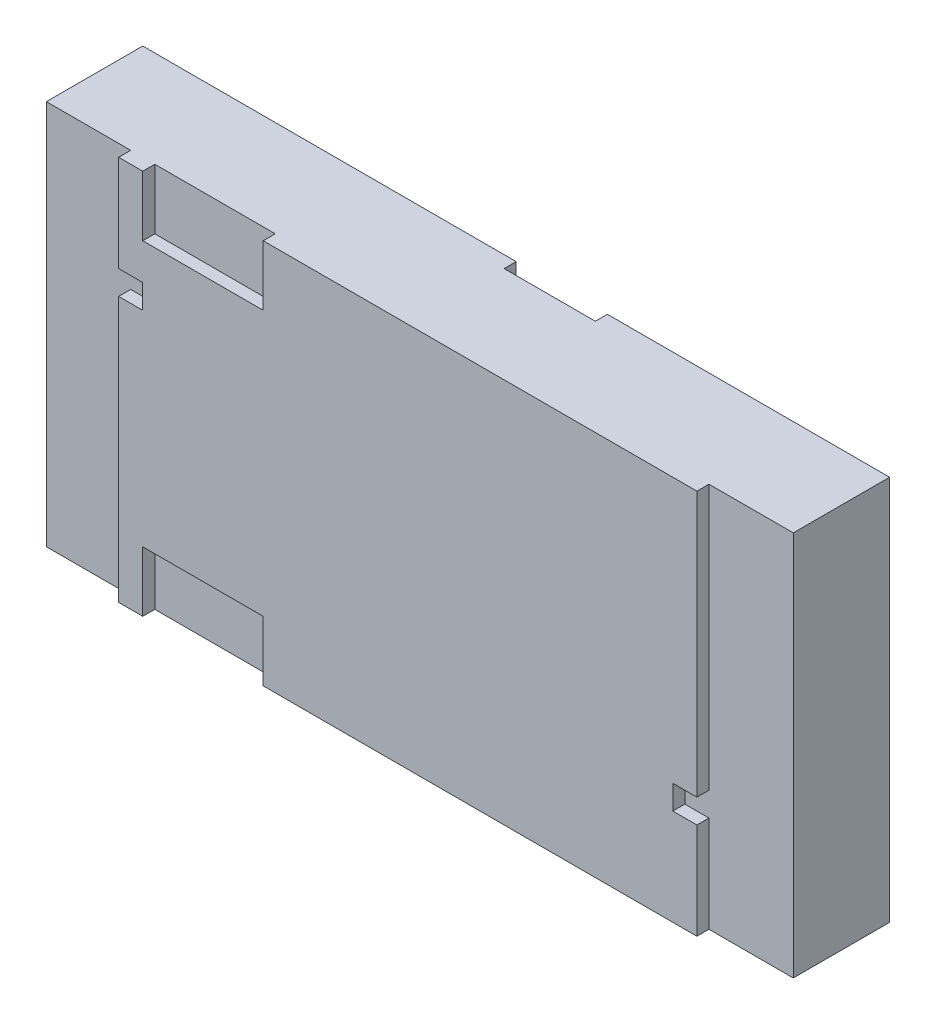
ISO-10303-21;
HEADER;
FILE_DESCRIPTION(('STEP AP214'),'2;1');
FILE_NAME('part.step','',(''),(''),'','','');
FILE_SCHEMA(('AUTOMOTIVE_DESIGN { 1 0 10303 214 1 1 1 1 }'));
ENDSEC;
DATA;
#1=APPLICATION_CONTEXT('core data for automotive mechanical design processes');
#2=APPLICATION_PROTOCOL_DEFINITION('international standard','automotive_design',2000,#1);
#3=PRODUCT_CONTEXT('',#1,'mechanical');
#4=PRODUCT('Part','Part','',(#3));
#5=PRODUCT_RELATED_PRODUCT_CATEGORY('part','',(#4));
#6=PRODUCT_DEFINITION_FORMATION('','',#4);
#7=PRODUCT_DEFINITION_CONTEXT('part definition',#1,'design');
#8=PRODUCT_DEFINITION('design','',#6,#7);
#9=PRODUCT_DEFINITION_SHAPE('','',#8);
#10=(LENGTH_UNIT() NAMED_UNIT(*) SI_UNIT(.MILLI.,.METRE.));
#11=(NAMED_UNIT(*) PLANE_ANGLE_UNIT() SI_UNIT($,.RADIAN.));
#12=(NAMED_UNIT(*) SI_UNIT($,.STERADIAN.) SOLID_ANGLE_UNIT());
#13=UNCERTAINTY_MEASURE_WITH_UNIT(LENGTH_MEASURE(1.E-05),#10,'distance_accuracy_value','');
#14=(GEOMETRIC_REPRESENTATION_CONTEXT(3) GLOBAL_UNCERTAINTY_ASSIGNED_CONTEXT((#13)) GLOBAL_UNIT_ASSIGNED_CONTEXT((#10,
#11,#12)) REPRESENTATION_CONTEXT('',''));
#15=CARTESIAN_POINT('',(0.,0.,0.));
#16=DIRECTION('',(0.,0.,1.));
#17=DIRECTION('',(1.,0.,0.));
#18=AXIS2_PLACEMENT_3D('',#15,#16,#17);
#19=CARTESIAN_POINT('',(1.6,0.8,0.));
#20=DIRECTION('',(0.,1.,0.));
#21=DIRECTION('',(1.,0.,0.));
#22=AXIS2_PLACEMENT_3D('',#19,#20,#21);
#23=PLANE('',#22);
#24=DIRECTION('',(0.,0.,-1.));
#25=VECTOR('',#24,1.);
#26=CARTESIAN_POINT('',(0.,0.80000000001,0.02500000001));
#27=LINE('',#26,#25);
#28=CARTESIAN_POINT('',(0.,0.8,0.1));
#29=VERTEX_POINT('',#28);
#30=CARTESIAN_POINT('',(0.,0.8,0.05));
#31=VERTEX_POINT('',#30);
#32=EDGE_CURVE('E345',#29,#31,#27,.T.);
#33=ORIENTED_EDGE('',*,*,#32,.T.);
#34=DIRECTION('',(1.,0.,0.));
#35=VECTOR('',#34,1.);
#36=CARTESIAN_POINT('',(0.02500000001,0.80000000001,0.05000000001));
#37=LINE('',#36,#35);
#38=CARTESIAN_POINT('',(-1.55,0.8,0.05));
#39=VERTEX_POINT('',#38);
#40=EDGE_CURVE('E538',#39,#31,#37,.T.);
#41=ORIENTED_EDGE('',*,*,#40,.F.);
#42=DIRECTION('',(0.,0.,-1.));
#43=VECTOR('',#42,1.);
#44=CARTESIAN_POINT('',(-1.55000000001,0.80000000001,0.22500000001));
#45=LINE('',#44,#43);
#46=CARTESIAN_POINT('',(-1.55,0.8,0.45));
#47=VERTEX_POINT('',#46);
#48=EDGE_CURVE('E407',#47,#39,#45,.T.);
#49=ORIENTED_EDGE('',*,*,#48,.F.);
#50=DIRECTION('',(1.,0.,0.));
#51=VECTOR('',#50,1.);
#52=CARTESIAN_POINT('',(0.37500000001,0.80000000001,0.45000000001));
#53=LINE('',#52,#51);
#54=CARTESIAN_POINT('',(-1.2,0.8,0.45));
#55=VERTEX_POINT('',#54);
#56=EDGE_CURVE('E371',#47,#55,#53,.T.);
#57=ORIENTED_EDGE('',*,*,#56,.T.);
#58=DIRECTION('',(0.,0.,1.));
#59=VECTOR('',#58,1.);
#60=CARTESIAN_POINT('',(-1.20000000001,0.80000000001,0.45000000001));
#61=LINE('',#60,#59);
#62=CARTESIAN_POINT('',(-1.2,0.8,0.5));
#63=VERTEX_POINT('',#62);
#64=EDGE_CURVE('E11',#55,#63,#61,.T.);
#65=ORIENTED_EDGE('',*,*,#64,.T.);
#66=DIRECTION('',(1.,0.,0.));
#67=VECTOR('',#66,1.);
#68=CARTESIAN_POINT('',(-0.55000000001,0.80000000001,0.50000000001));
#69=LINE('',#68,#67);
#70=CARTESIAN_POINT('',(-1.1,0.8,0.5));
#71=VERTEX_POINT('',#70);
#72=EDGE_CURVE('E610',#63,#71,#69,.T.);
#73=ORIENTED_EDGE('',*,*,#72,.T.);
#74=DIRECTION('',(0.,0.,1.));
#75=VECTOR('',#74,1.);
#76=CARTESIAN_POINT('',(-1.10000000001,0.80000000001,0.45000000001));
#77=LINE('',#76,#75);
#78=CARTESIAN_POINT('',(-1.1,0.8,0.45));
#79=VERTEX_POINT('',#78);
#80=EDGE_CURVE('E627',#79,#71,#77,.T.);
#81=ORIENTED_EDGE('',*,*,#80,.F.);
#82=DIRECTION('',(1.,0.,0.));
#83=VECTOR('',#82,1.);
#84=CARTESIAN_POINT('',(0.37500000001,0.80000000001,0.45000000001));
#85=LINE('',#84,#83);
#86=CARTESIAN_POINT('',(-0.6,0.8,0.45));
#87=VERTEX_POINT('',#86);
#88=EDGE_CURVE('E416',#79,#87,#85,.T.);
#89=ORIENTED_EDGE('',*,*,#88,.T.);
#90=DIRECTION('',(0.,0.,1.));
#91=VECTOR('',#90,1.);
#92=CARTESIAN_POINT('',(-0.60000000001,0.80000000001,0.25000000001));
#93=LINE('',#92,#91);
#94=CARTESIAN_POINT('',(-0.6,0.8,0.5));
#95=VERTEX_POINT('',#94);
#96=EDGE_CURVE('E340',#87,#95,#93,.T.);
#97=ORIENTED_EDGE('',*,*,#96,.T.);
#98=DIRECTION('',(-1.,0.,0.));
#99=VECTOR('',#98,1.);
#100=CARTESIAN_POINT('',(1.60000000001,0.80000000001,0.50000000001));
#101=LINE('',#100,#99);
#102=CARTESIAN_POINT('',(1.2,0.8,0.5));
#103=VERTEX_POINT('',#102);
#104=EDGE_CURVE('E354',#103,#95,#101,.T.);
#105=ORIENTED_EDGE('',*,*,#104,.F.);
#106=DIRECTION('',(0.,0.,1.));
#107=VECTOR('',#106,1.);
#108=CARTESIAN_POINT('',(1.20000000001,0.80000000001,0.45000000001));
#109=LINE('',#108,#107);
#110=CARTESIAN_POINT('',(1.2,0.8,0.45));
#111=VERTEX_POINT('',#110);
#112=EDGE_CURVE('E307',#111,#103,#109,.T.);
#113=ORIENTED_EDGE('',*,*,#112,.F.);
#114=DIRECTION('',(-1.,0.,0.));
#115=VECTOR('',#114,1.);
#116=CARTESIAN_POINT('',(1.57500000001,0.80000000001,0.45000000001));
#117=LINE('',#116,#115);
#118=CARTESIAN_POINT('',(1.55,0.8,0.45));
#119=VERTEX_POINT('',#118);
#120=EDGE_CURVE('E26',#119,#111,#117,.T.);
#121=ORIENTED_EDGE('',*,*,#120,.F.);
#122=DIRECTION('',(0.,0.,1.));
#123=VECTOR('',#122,1.);
#124=CARTESIAN_POINT('',(1.55000000001,0.80000000001,0.02500000001));
#125=LINE('',#124,#123);
#126=CARTESIAN_POINT('',(1.55,0.8,0.05));
#127=VERTEX_POINT('',#126);
#128=EDGE_CURVE('E630',#127,#119,#125,.T.);
#129=ORIENTED_EDGE('',*,*,#128,.F.);
#130=DIRECTION('',(1.,0.,0.));
#131=VECTOR('',#130,1.);
#132=CARTESIAN_POINT('',(0.02500000001,0.80000000001,0.05000000001));
#133=LINE('',#132,#131);
#134=CARTESIAN_POINT('',(0.378524799956,0.8,0.05));
#135=VERTEX_POINT('',#134);
#136=EDGE_CURVE('E522',#135,#127,#133,.T.);
#137=ORIENTED_EDGE('',*,*,#136,.F.);
#138=DIRECTION('',(0.,0.,1.));
#139=VECTOR('',#138,1.);
#140=CARTESIAN_POINT('',(0.378524799966,0.80000000001,0.02500000001));
#141=LINE('',#140,#139);
#142=CARTESIAN_POINT('',(0.378524799956,0.8,0.1));
#143=VERTEX_POINT('',#142);
#144=EDGE_CURVE('E20',#135,#143,#141,.T.);
#145=ORIENTED_EDGE('',*,*,#144,.T.);
#146=DIRECTION('',(-1.,0.,0.));
#147=VECTOR('',#146,1.);
#148=CARTESIAN_POINT('',(0.894631199999,0.80000000001,0.10000000001));
#149=LINE('',#148,#147);
#150=EDGE_CURVE('E374',#143,#29,#149,.T.);
#151=ORIENTED_EDGE('',*,*,#150,.T.);
#152=EDGE_LOOP('',(#33,#41,#49,#57,#65,#73,#81,#89,#97,#105,#113,#121,#129,#137,#145,#151));
#153=FACE_BOUND('',#152,.T.);
#154=ADVANCED_FACE('F17',(#153),#23,.T.);
#155=CARTESIAN_POINT('',(1.55,-0.8,0.45));
#156=DIRECTION('',(0.,0.,1.));
#157=DIRECTION('',(1.,0.,0.));
#158=AXIS2_PLACEMENT_3D('',#155,#156,#157);
#159=PLANE('',#158);
#160=DIRECTION('',(0.,-1.,0.));
#161=VECTOR('',#160,1.);
#162=CARTESIAN_POINT('',(-1.10000000001,-0.80000000001,0.45000000001));
#163=LINE('',#162,#161);
#164=CARTESIAN_POINT('',(-1.1,-0.55,0.45));
#165=VERTEX_POINT('',#164);
#166=CARTESIAN_POINT('',(-1.1,-0.8,0.45));
#167=VERTEX_POINT('',#166);
#168=EDGE_CURVE('E383',#165,#167,#163,.T.);
#169=ORIENTED_EDGE('',*,*,#168,.T.);
#170=DIRECTION('',(-1.,0.,0.));
#171=VECTOR('',#170,1.);
#172=CARTESIAN_POINT('',(-1.22500000001,-0.80000000001,0.45000000001));
#173=LINE('',#172,#171);
#174=CARTESIAN_POINT('',(-0.6,-0.8,0.45));
#175=VERTEX_POINT('',#174);
#176=EDGE_CURVE('E321',#175,#167,#173,.T.);
#177=ORIENTED_EDGE('',*,*,#176,.F.);
#178=DIRECTION('',(0.,-1.,0.));
#179=VECTOR('',#178,1.);
#180=CARTESIAN_POINT('',(-0.60000000001,-0.27500000001,0.45000000001));
#181=LINE('',#180,#179);
#182=CARTESIAN_POINT('',(-0.6,-0.55,0.45));
#183=VERTEX_POINT('',#182);
#184=EDGE_CURVE('E313',#183,#175,#181,.T.);
#185=ORIENTED_EDGE('',*,*,#184,.F.);
#186=DIRECTION('',(1.,0.,0.));
#187=VECTOR('',#186,1.);
#188=CARTESIAN_POINT('',(-0.97500000001,-0.55000000001,0.45000000001));
#189=LINE('',#188,#187);
#190=EDGE_CURVE('E295',#165,#183,#189,.T.);
#191=ORIENTED_EDGE('',*,*,#190,.F.);
#192=EDGE_LOOP('',(#169,#177,#185,#191));
#193=FACE_BOUND('',#192,.T.);
#194=ADVANCED_FACE('F319',(#193),#159,.T.);
#195=CARTESIAN_POINT('',(-1.2,0.8,0.45));
#196=DIRECTION('',(-1.,0.,0.));
#197=DIRECTION('',(0.,0.,1.));
#198=AXIS2_PLACEMENT_3D('',#195,#196,#197);
#199=PLANE('',#198);
#200=DIRECTION('',(0.,1.,0.));
#201=VECTOR('',#200,1.);
#202=CARTESIAN_POINT('',(-1.20000000001,0.40000000001,0.50000000001));
#203=LINE('',#202,#201);
#204=CARTESIAN_POINT('',(-1.2,0.4,0.5));
#205=VERTEX_POINT('',#204);
#206=EDGE_CURVE('E567',#205,#63,#203,.T.);
#207=ORIENTED_EDGE('',*,*,#206,.T.);
#208=ORIENTED_EDGE('',*,*,#64,.F.);
#209=DIRECTION('',(0.,1.,0.));
#210=VECTOR('',#209,1.);
#211=CARTESIAN_POINT('',(-1.20000000001,1.000095409791E-11,0.45000000001));
#212=LINE('',#211,#210);
#213=CARTESIAN_POINT('',(-1.2,0.4,0.45));
#214=VERTEX_POINT('',#213);
#215=EDGE_CURVE('E375',#214,#55,#212,.T.);
#216=ORIENTED_EDGE('',*,*,#215,.F.);
#217=DIRECTION('',(0.,0.,1.));
#218=VECTOR('',#217,1.);
#219=CARTESIAN_POINT('',(-1.20000000001,0.40000000001,0.45000000001));
#220=LINE('',#219,#218);
#221=EDGE_CURVE('E359',#214,#205,#220,.T.);
#222=ORIENTED_EDGE('',*,*,#221,.T.);
#223=EDGE_LOOP('',(#207,#208,#216,#222));
#224=FACE_BOUND('',#223,.T.);
#225=ADVANCED_FACE('F658',(#224),#199,.T.);
#226=CARTESIAN_POINT('',(-1.1,-0.8,0.5));
#227=DIRECTION('',(-1.,0.,0.));
#228=DIRECTION('',(0.,0.,1.));
#229=AXIS2_PLACEMENT_3D('',#226,#227,#228);
#230=PLANE('',#229);
#231=DIRECTION('',(0.,0.,1.));
#232=VECTOR('',#231,1.);
#233=CARTESIAN_POINT('',(-1.10000000001,0.30000000001,0.47500000001));
#234=LINE('',#233,#232);
#235=CARTESIAN_POINT('',(-1.1,0.3,0.45));
#236=VERTEX_POINT('',#235);
#237=CARTESIAN_POINT('',(-1.1,0.3,0.5));
#238=VERTEX_POINT('',#237);
#239=EDGE_CURVE('E393',#236,#238,#234,.T.);
#240=ORIENTED_EDGE('',*,*,#239,.T.);
#241=DIRECTION('',(0.,1.,0.));
#242=VECTOR('',#241,1.);
#243=CARTESIAN_POINT('',(-1.10000000001,-0.40000000001,0.50000000001));
#244=LINE('',#243,#242);
#245=CARTESIAN_POINT('',(-1.1,0.4,0.5));
#246=VERTEX_POINT('',#245);
#247=EDGE_CURVE('E564',#238,#246,#244,.T.);
#248=ORIENTED_EDGE('',*,*,#247,.T.);
#249=DIRECTION('',(0.,0.,-1.));
#250=VECTOR('',#249,1.);
#251=CARTESIAN_POINT('',(-1.10000000001,0.40000000001,0.47500000001));
#252=LINE('',#251,#250);
#253=CARTESIAN_POINT('',(-1.1,0.4,0.45));
#254=VERTEX_POINT('',#253);
#255=EDGE_CURVE('E481',#246,#254,#252,.T.);
#256=ORIENTED_EDGE('',*,*,#255,.T.);
#257=DIRECTION('',(0.,1.,0.));
#258=VECTOR('',#257,1.);
#259=CARTESIAN_POINT('',(-1.10000000001,-0.80000000001,0.45000000001));
#260=LINE('',#259,#258);
#261=EDGE_CURVE('E442',#236,#254,#260,.T.);
#262=ORIENTED_EDGE('',*,*,#261,.F.);
#263=EDGE_LOOP('',(#240,#248,#256,#262));
#264=FACE_BOUND('',#263,.T.);
#265=ADVANCED_FACE('F653',(#264),#230,.T.);
#266=CARTESIAN_POINT('',(1.55,-0.8,0.45));
#267=DIRECTION('',(0.,0.,1.));
#268=DIRECTION('',(1.,0.,0.));
#269=AXIS2_PLACEMENT_3D('',#266,#267,#268);
#270=PLANE('',#269);
#271=DIRECTION('',(-1.,0.,0.));
#272=VECTOR('',#271,1.);
#273=CARTESIAN_POINT('',(1.32500000001,-0.30000000001,0.45000000001));
#274=LINE('',#273,#272);
#275=CARTESIAN_POINT('',(1.2,-0.3,0.45));
#276=VERTEX_POINT('',#275);
#277=CARTESIAN_POINT('',(1.1,-0.3,0.45));
#278=VERTEX_POINT('',#277);
#279=EDGE_CURVE('E438',#276,#278,#274,.T.);
#280=ORIENTED_EDGE('',*,*,#279,.T.);
#281=DIRECTION('',(0.,-1.,0.));
#282=VECTOR('',#281,1.);
#283=CARTESIAN_POINT('',(1.10000000001,-0.80000000001,0.45000000001));
#284=LINE('',#283,#282);
#285=CARTESIAN_POINT('',(1.1,-0.4,0.45));
#286=VERTEX_POINT('',#285);
#287=EDGE_CURVE('E535',#278,#286,#284,.T.);
#288=ORIENTED_EDGE('',*,*,#287,.T.);
#289=DIRECTION('',(1.,0.,0.));
#290=VECTOR('',#289,1.);
#291=CARTESIAN_POINT('',(1.37500000001,-0.40000000001,0.45000000001));
#292=LINE('',#291,#290);
#293=CARTESIAN_POINT('',(1.2,-0.4,0.45));
#294=VERTEX_POINT('',#293);
#295=EDGE_CURVE('E341',#286,#294,#292,.T.);
#296=ORIENTED_EDGE('',*,*,#295,.T.);
#297=DIRECTION('',(0.,-1.,0.));
#298=VECTOR('',#297,1.);
#299=CARTESIAN_POINT('',(1.20000000001,-0.80000000001,0.45000000001));
#300=LINE('',#299,#298);
#301=CARTESIAN_POINT('',(1.2,-0.8,0.45));
#302=VERTEX_POINT('',#301);
#303=EDGE_CURVE('E306',#294,#302,#300,.T.);
#304=ORIENTED_EDGE('',*,*,#303,.T.);
#305=DIRECTION('',(1.,0.,0.));
#306=VECTOR('',#305,1.);
#307=CARTESIAN_POINT('',(-0.02500000001,-0.80000000001,0.45000000001));
#308=LINE('',#307,#306);
#309=CARTESIAN_POINT('',(1.55,-0.8,0.45));
#310=VERTEX_POINT('',#309);
#311=EDGE_CURVE('E485',#302,#310,#308,.T.);
#312=ORIENTED_EDGE('',*,*,#311,.T.);
#313=DIRECTION('',(0.,1.,0.));
#314=VECTOR('',#313,1.);
#315=CARTESIAN_POINT('',(1.55000000001,-0.80000000001,0.45000000001));
#316=LINE('',#315,#314);
#317=EDGE_CURVE('E634',#310,#119,#316,.T.);
#318=ORIENTED_EDGE('',*,*,#317,.T.);
#319=ORIENTED_EDGE('',*,*,#120,.T.);
#320=DIRECTION('',(0.,-1.,0.));
#321=VECTOR('',#320,1.);
#322=CARTESIAN_POINT('',(1.20000000001,-0.55000000001,0.45000000001));
#323=LINE('',#322,#321);
#324=EDGE_CURVE('E560',#111,#276,#323,.T.);
#325=ORIENTED_EDGE('',*,*,#324,.T.);
#326=EDGE_LOOP('',(#280,#288,#296,#304,#312,#318,#319,#325));
#327=FACE_BOUND('',#326,.T.);
#328=ADVANCED_FACE('F706',(#327),#270,.T.);
#329=CARTESIAN_POINT('',(1.1,-0.8,-0.448729564886));
#330=DIRECTION('',(1.,0.,0.));
#331=DIRECTION('',(0.,1.,0.));
#332=AXIS2_PLACEMENT_3D('',#329,#330,#331);
#333=PLANE('',#332);
#334=DIRECTION('',(0.,0.,1.));
#335=VECTOR('',#334,1.);
#336=CARTESIAN_POINT('',(1.10000000001,-0.30000000001,0.));
#337=LINE('',#336,#335);
#338=CARTESIAN_POINT('',(1.1,-0.3,0.5));
#339=VERTEX_POINT('',#338);
#340=EDGE_CURVE('E443',#278,#339,#337,.T.);
#341=ORIENTED_EDGE('',*,*,#340,.T.);
#342=DIRECTION('',(0.,-1.,0.));
#343=VECTOR('',#342,1.);
#344=CARTESIAN_POINT('',(1.10000000001,-0.40000000001,0.50000000001));
#345=LINE('',#344,#343);
#346=CARTESIAN_POINT('',(1.1,-0.4,0.5));
#347=VERTEX_POINT('',#346);
#348=EDGE_CURVE('E595',#339,#347,#345,.T.);
#349=ORIENTED_EDGE('',*,*,#348,.T.);
#350=DIRECTION('',(0.,0.,-1.));
#351=VECTOR('',#350,1.);
#352=CARTESIAN_POINT('',(1.10000000001,-0.40000000001,0.));
#353=LINE('',#352,#351);
#354=EDGE_CURVE('E336',#347,#286,#353,.T.);
#355=ORIENTED_EDGE('',*,*,#354,.T.);
#356=ORIENTED_EDGE('',*,*,#287,.F.);
#357=EDGE_LOOP('',(#341,#349,#355,#356));
#358=FACE_BOUND('',#357,.T.);
#359=ADVANCED_FACE('F847',(#358),#333,.T.);
#360=CARTESIAN_POINT('',(0.378524799956,-1.192176183007,0.05));
#361=DIRECTION('',(1.,0.,0.));
#362=DIRECTION('',(0.,1.,0.));
#363=AXIS2_PLACEMENT_3D('',#360,#361,#362);
#364=PLANE('',#363);
#365=DIRECTION('',(0.,0.,-1.));
#366=VECTOR('',#365,1.);
#367=CARTESIAN_POINT('',(0.378524799966,-0.80000000001,0.02500000001));
#368=LINE('',#367,#366);
#369=CARTESIAN_POINT('',(0.378524799956,-0.8,0.1));
#370=VERTEX_POINT('',#369);
#371=CARTESIAN_POINT('',(0.378524799956,-0.8,0.05));
#372=VERTEX_POINT('',#371);
#373=EDGE_CURVE('E444',#370,#372,#368,.T.);
#374=ORIENTED_EDGE('',*,*,#373,.F.);
#375=DIRECTION('',(0.,1.,0.));
#376=VECTOR('',#375,1.);
#377=CARTESIAN_POINT('',(0.378524799966,-1.192176183017,0.10000000001));
#378=LINE('',#377,#376);
#379=EDGE_CURVE('E432',#370,#143,#378,.T.);
#380=ORIENTED_EDGE('',*,*,#379,.T.);
#381=ORIENTED_EDGE('',*,*,#144,.F.);
#382=DIRECTION('',(0.,1.,0.));
#383=VECTOR('',#382,1.);
#384=CARTESIAN_POINT('',(0.378524799966,-0.996088091513,0.05000000001));
#385=LINE('',#384,#383);
#386=EDGE_CURVE('E518',#372,#135,#385,.T.);
#387=ORIENTED_EDGE('',*,*,#386,.F.);
#388=EDGE_LOOP('',(#374,#380,#381,#387));
#389=FACE_BOUND('',#388,.T.);
#390=ADVANCED_FACE('F717',(#389),#364,.F.);
#391=CARTESIAN_POINT('',(0.189262399978,-0.196088091503,0.1));
#392=DIRECTION('',(0.,0.,1.));
#393=DIRECTION('',(1.,0.,0.));
#394=AXIS2_PLACEMENT_3D('',#391,#392,#393);
#395=PLANE('',#394);
#396=DIRECTION('',(1.,0.,0.));
#397=VECTOR('',#396,1.);
#398=CARTESIAN_POINT('',(-0.705368800021,-0.80000000001,0.10000000001));
#399=LINE('',#398,#397);
#400=CARTESIAN_POINT('',(0.,-0.8,0.1));
#401=VERTEX_POINT('',#400);
#402=EDGE_CURVE('E449',#401,#370,#399,.T.);
#403=ORIENTED_EDGE('',*,*,#402,.F.);
#404=DIRECTION('',(0.,-1.,0.));
#405=VECTOR('',#404,1.);
#406=CARTESIAN_POINT('',(0.,0.80000000001,0.10000000001));
#407=LINE('',#406,#405);
#408=CARTESIAN_POINT('',(0.,-0.156530962986,0.1));
#409=VERTEX_POINT('',#408);
#410=EDGE_CURVE('E387',#409,#401,#407,.T.);
#411=ORIENTED_EDGE('',*,*,#410,.F.);
#412=DIRECTION('',(1.,0.,0.));
#413=VECTOR('',#412,1.);
#414=CARTESIAN_POINT('',(0.35764640824,-0.156530962996,0.10000000001));
#415=LINE('',#414,#413);
#416=CARTESIAN_POINT('',(-0.35764640823,-0.156530962986,0.1));
#417=VERTEX_POINT('',#416);
#418=EDGE_CURVE('E464',#417,#409,#415,.T.);
#419=ORIENTED_EDGE('',*,*,#418,.F.);
#420=DIRECTION('',(0.,-1.,0.));
#421=VECTOR('',#420,1.);
#422=CARTESIAN_POINT('',(-0.35764640824,-0.156530962996,0.10000000001));
#423=LINE('',#422,#421);
#424=CARTESIAN_POINT('',(-0.35764640823,0.156530962986,0.1));
#425=VERTEX_POINT('',#424);
#426=EDGE_CURVE('E334',#425,#417,#423,.T.);
#427=ORIENTED_EDGE('',*,*,#426,.F.);
#428=DIRECTION('',(-1.,0.,0.));
#429=VECTOR('',#428,1.);
#430=CARTESIAN_POINT('',(-0.35764640824,0.156530962996,0.10000000001));
#431=LINE('',#430,#429);
#432=CARTESIAN_POINT('',(0.,0.156530962986,0.1));
#433=VERTEX_POINT('',#432);
#434=EDGE_CURVE('E369',#433,#425,#431,.T.);
#435=ORIENTED_EDGE('',*,*,#434,.F.);
#436=DIRECTION('',(0.,-1.,0.));
#437=VECTOR('',#436,1.);
#438=CARTESIAN_POINT('',(0.,0.80000000001,0.10000000001));
#439=LINE('',#438,#437);
#440=EDGE_CURVE('E420',#29,#433,#439,.T.);
#441=ORIENTED_EDGE('',*,*,#440,.F.);
#442=ORIENTED_EDGE('',*,*,#150,.F.);
#443=ORIENTED_EDGE('',*,*,#379,.F.);
#444=EDGE_LOOP('',(#403,#411,#419,#427,#435,#441,#442,#443));
#445=FACE_BOUND('',#444,.T.);
#446=ADVANCED_FACE('F846',(#445),#395,.F.);
#447=CARTESIAN_POINT('',(1.55,-0.8,0.45));
#448=DIRECTION('',(0.,0.,1.));
#449=DIRECTION('',(1.,0.,0.));
#450=AXIS2_PLACEMENT_3D('',#447,#448,#449);
#451=PLANE('',#450);
#452=DIRECTION('',(0.,1.,0.));
#453=VECTOR('',#452,1.);
#454=CARTESIAN_POINT('',(-1.20000000001,-0.25000000001,0.45000000001));
#455=LINE('',#454,#453);
#456=CARTESIAN_POINT('',(-1.2,-0.8,0.45));
#457=VERTEX_POINT('',#456);
#458=CARTESIAN_POINT('',(-1.2,0.3,0.45));
#459=VERTEX_POINT('',#458);
#460=EDGE_CURVE('E499',#457,#459,#455,.T.);
#461=ORIENTED_EDGE('',*,*,#460,.T.);
#462=DIRECTION('',(1.,0.,0.));
#463=VECTOR('',#462,1.);
#464=CARTESIAN_POINT('',(0.22500000001,0.30000000001,0.45000000001));
#465=LINE('',#464,#463);
#466=EDGE_CURVE('E388',#459,#236,#465,.T.);
#467=ORIENTED_EDGE('',*,*,#466,.T.);
#468=ORIENTED_EDGE('',*,*,#261,.T.);
#469=DIRECTION('',(-1.,0.,0.));
#470=VECTOR('',#469,1.);
#471=CARTESIAN_POINT('',(0.17500000001,0.40000000001,0.45000000001));
#472=LINE('',#471,#470);
#473=EDGE_CURVE('E571',#254,#214,#472,.T.);
#474=ORIENTED_EDGE('',*,*,#473,.T.);
#475=ORIENTED_EDGE('',*,*,#215,.T.);
#476=ORIENTED_EDGE('',*,*,#56,.F.);
#477=DIRECTION('',(0.,-1.,0.));
#478=VECTOR('',#477,1.);
#479=CARTESIAN_POINT('',(-1.55000000001,-0.80000000001,0.45000000001));
#480=LINE('',#479,#478);
#481=CARTESIAN_POINT('',(-1.55,-0.8,0.45));
#482=VERTEX_POINT('',#481);
#483=EDGE_CURVE('E404',#47,#482,#480,.T.);
#484=ORIENTED_EDGE('',*,*,#483,.T.);
#485=DIRECTION('',(-1.,0.,0.));
#486=VECTOR('',#485,1.);
#487=CARTESIAN_POINT('',(-1.22500000001,-0.80000000001,0.45000000001));
#488=LINE('',#487,#486);
#489=EDGE_CURVE('E507',#457,#482,#488,.T.);
#490=ORIENTED_EDGE('',*,*,#489,.F.);
#491=EDGE_LOOP('',(#461,#467,#468,#474,#475,#476,#484,#490));
#492=FACE_BOUND('',#491,.T.);
#493=ADVANCED_FACE('F647',(#492),#451,.T.);
#494=CARTESIAN_POINT('',(1.1,-0.3,0.45));
#495=DIRECTION('',(0.,-1.,0.));
#496=DIRECTION('',(0.,0.,-1.));
#497=AXIS2_PLACEMENT_3D('',#494,#495,#496);
#498=PLANE('',#497);
#499=DIRECTION('',(-1.,0.,0.));
#500=VECTOR('',#499,1.);
#501=CARTESIAN_POINT('',(0.55000000001,-0.30000000001,0.50000000001));
#502=LINE('',#501,#500);
#503=CARTESIAN_POINT('',(1.2,-0.3,0.5));
#504=VERTEX_POINT('',#503);
#505=EDGE_CURVE('E582',#504,#339,#502,.T.);
#506=ORIENTED_EDGE('',*,*,#505,.T.);
#507=ORIENTED_EDGE('',*,*,#340,.F.);
#508=ORIENTED_EDGE('',*,*,#279,.F.);
#509=DIRECTION('',(0.,0.,1.));
#510=VECTOR('',#509,1.);
#511=CARTESIAN_POINT('',(1.20000000001,-0.30000000001,0.45000000001));
#512=LINE('',#511,#510);
#513=EDGE_CURVE('E392',#276,#504,#512,.T.);
#514=ORIENTED_EDGE('',*,*,#513,.T.);
#515=EDGE_LOOP('',(#506,#507,#508,#514));
#516=FACE_BOUND('',#515,.T.);
#517=ADVANCED_FACE('F918',(#516),#498,.T.);
#518=CARTESIAN_POINT('',(-0.6,0.8,0.5));
#519=DIRECTION('',(1.,0.,0.));
#520=DIRECTION('',(0.,1.,0.));
#521=AXIS2_PLACEMENT_3D('',#518,#519,#520);
#522=PLANE('',#521);
#523=DIRECTION('',(0.,-1.,0.));
#524=VECTOR('',#523,1.);
#525=CARTESIAN_POINT('',(-0.60000000001,0.40000000001,0.45000000001));
#526=LINE('',#525,#524);
#527=CARTESIAN_POINT('',(-0.6,0.55,0.45));
#528=VERTEX_POINT('',#527);
#529=EDGE_CURVE('E480',#87,#528,#526,.T.);
#530=ORIENTED_EDGE('',*,*,#529,.T.);
#531=DIRECTION('',(0.,0.,-1.));
#532=VECTOR('',#531,1.);
#533=CARTESIAN_POINT('',(-0.60000000001,0.55000000001,0.50000000001));
#534=LINE('',#533,#532);
#535=CARTESIAN_POINT('',(-0.6,0.55,0.5));
#536=VERTEX_POINT('',#535);
#537=EDGE_CURVE('E360',#536,#528,#534,.T.);
#538=ORIENTED_EDGE('',*,*,#537,.F.);
#539=DIRECTION('',(0.,-1.,0.));
#540=VECTOR('',#539,1.);
#541=CARTESIAN_POINT('',(-0.60000000001,0.40000000001,0.50000000001));
#542=LINE('',#541,#540);
#543=EDGE_CURVE('E350',#95,#536,#542,.T.);
#544=ORIENTED_EDGE('',*,*,#543,.F.);
#545=ORIENTED_EDGE('',*,*,#96,.F.);
#546=EDGE_LOOP('',(#530,#538,#544,#545));
#547=FACE_BOUND('',#546,.T.);
#548=ADVANCED_FACE('F695',(#547),#522,.F.);
#549=CARTESIAN_POINT('',(1.2,-0.4,0.45));
#550=DIRECTION('',(0.,1.,0.));
#551=DIRECTION('',(1.,0.,0.));
#552=AXIS2_PLACEMENT_3D('',#549,#550,#551);
#553=PLANE('',#552);
#554=DIRECTION('',(1.,0.,0.));
#555=VECTOR('',#554,1.);
#556=CARTESIAN_POINT('',(0.60000000001,-0.40000000001,0.50000000001));
#557=LINE('',#556,#555);
#558=CARTESIAN_POINT('',(1.2,-0.4,0.5));
#559=VERTEX_POINT('',#558);
#560=EDGE_CURVE('E415',#347,#559,#557,.T.);
#561=ORIENTED_EDGE('',*,*,#560,.T.);
#562=DIRECTION('',(0.,0.,1.));
#563=VECTOR('',#562,1.);
#564=CARTESIAN_POINT('',(1.20000000001,-0.40000000001,0.45000000001));
#565=LINE('',#564,#563);
#566=EDGE_CURVE('E408',#294,#559,#565,.T.);
#567=ORIENTED_EDGE('',*,*,#566,.F.);
#568=ORIENTED_EDGE('',*,*,#295,.F.);
#569=ORIENTED_EDGE('',*,*,#354,.F.);
#570=EDGE_LOOP('',(#561,#567,#568,#569));
#571=FACE_BOUND('',#570,.T.);
#572=ADVANCED_FACE('F727',(#571),#553,.T.);
#573=CARTESIAN_POINT('',(1.55,-0.8,0.05));
#574=DIRECTION('',(1.,0.,0.));
#575=DIRECTION('',(0.,1.,0.));
#576=AXIS2_PLACEMENT_3D('',#573,#574,#575);
#577=PLANE('',#576);
#578=DIRECTION('',(0.,0.,-1.));
#579=VECTOR('',#578,1.);
#580=CARTESIAN_POINT('',(1.55000000001,-0.80000000001,0.02500000001));
#581=LINE('',#580,#579);
#582=CARTESIAN_POINT('',(1.55,-0.8,0.05));
#583=VERTEX_POINT('',#582);
#584=EDGE_CURVE('E461',#310,#583,#581,.T.);
#585=ORIENTED_EDGE('',*,*,#584,.T.);
#586=DIRECTION('',(0.,-1.,0.));
#587=VECTOR('',#586,1.);
#588=CARTESIAN_POINT('',(1.55000000001,-0.80000000001,0.05000000001));
#589=LINE('',#588,#587);
#590=EDGE_CURVE('E526',#127,#583,#589,.T.);
#591=ORIENTED_EDGE('',*,*,#590,.F.);
#592=ORIENTED_EDGE('',*,*,#128,.T.);
#593=ORIENTED_EDGE('',*,*,#317,.F.);
#594=EDGE_LOOP('',(#585,#591,#592,#593));
#595=FACE_BOUND('',#594,.T.);
#596=ADVANCED_FACE('F710',(#595),#577,.T.);
#597=CARTESIAN_POINT('',(-1.1,0.4,0.45));
#598=DIRECTION('',(1.,0.,0.));
#599=DIRECTION('',(0.,-1.,0.));
#600=AXIS2_PLACEMENT_3D('',#597,#598,#599);
#601=PLANE('',#600);
#602=DIRECTION('',(0.,0.,-1.));
#603=VECTOR('',#602,1.);
#604=CARTESIAN_POINT('',(-1.10000000001,0.55000000001,0.50000000001));
#605=LINE('',#604,#603);
#606=CARTESIAN_POINT('',(-1.1,0.55,0.5));
#607=VERTEX_POINT('',#606);
#608=CARTESIAN_POINT('',(-1.1,0.55,0.45));
#609=VERTEX_POINT('',#608);
#610=EDGE_CURVE('E421',#607,#609,#605,.T.);
#611=ORIENTED_EDGE('',*,*,#610,.T.);
#612=DIRECTION('',(0.,-1.,0.));
#613=VECTOR('',#612,1.);
#614=CARTESIAN_POINT('',(-1.10000000001,-0.20000000001,0.45000000001));
#615=LINE('',#614,#613);
#616=EDGE_CURVE('E477',#79,#609,#615,.T.);
#617=ORIENTED_EDGE('',*,*,#616,.F.);
#618=ORIENTED_EDGE('',*,*,#80,.T.);
#619=DIRECTION('',(0.,-1.,0.));
#620=VECTOR('',#619,1.);
#621=CARTESIAN_POINT('',(-1.10000000001,0.20000000001,0.50000000001));
#622=LINE('',#621,#620);
#623=EDGE_CURVE('E353',#71,#607,#622,.T.);
#624=ORIENTED_EDGE('',*,*,#623,.T.);
#625=EDGE_LOOP('',(#611,#617,#618,#624));
#626=FACE_BOUND('',#625,.T.);
#627=ADVANCED_FACE('F687',(#626),#601,.T.);
#628=CARTESIAN_POINT('',(-1.55,-0.8,0.45));
#629=DIRECTION('',(-1.,0.,0.));
#630=DIRECTION('',(0.,0.,1.));
#631=AXIS2_PLACEMENT_3D('',#628,#629,#630);
#632=PLANE('',#631);
#633=DIRECTION('',(0.,0.,1.));
#634=VECTOR('',#633,1.);
#635=CARTESIAN_POINT('',(-1.55000000001,-0.80000000001,0.22500000001));
#636=LINE('',#635,#634);
#637=CARTESIAN_POINT('',(-1.55,-0.8,0.05));
#638=VERTEX_POINT('',#637);
#639=EDGE_CURVE('E511',#638,#482,#636,.T.);
#640=ORIENTED_EDGE('',*,*,#639,.T.);
#641=ORIENTED_EDGE('',*,*,#483,.F.);
#642=ORIENTED_EDGE('',*,*,#48,.T.);
#643=DIRECTION('',(0.,-1.,0.));
#644=VECTOR('',#643,1.);
#645=CARTESIAN_POINT('',(-1.55000000001,-0.80000000001,0.05000000001));
#646=LINE('',#645,#644);
#647=EDGE_CURVE('E532',#39,#638,#646,.T.);
#648=ORIENTED_EDGE('',*,*,#647,.T.);
#649=EDGE_LOOP('',(#640,#641,#642,#648));
#650=FACE_BOUND('',#649,.T.);
#651=ADVANCED_FACE('F666',(#650),#632,.T.);
#652=CARTESIAN_POINT('',(1.2,-0.8,0.45));
#653=DIRECTION('',(1.,0.,0.));
#654=DIRECTION('',(0.,1.,0.));
#655=AXIS2_PLACEMENT_3D('',#652,#653,#654);
#656=PLANE('',#655);
#657=DIRECTION('',(0.,-1.,0.));
#658=VECTOR('',#657,1.);
#659=CARTESIAN_POINT('',(1.20000000001,-0.40000000001,0.50000000001));
#660=LINE('',#659,#658);
#661=CARTESIAN_POINT('',(1.2,-0.8,0.5));
#662=VERTEX_POINT('',#661);
#663=EDGE_CURVE('E412',#559,#662,#660,.T.);
#664=ORIENTED_EDGE('',*,*,#663,.T.);
#665=DIRECTION('',(0.,0.,1.));
#666=VECTOR('',#665,1.);
#667=CARTESIAN_POINT('',(1.20000000001,-0.80000000001,0.45000000001));
#668=LINE('',#667,#666);
#669=EDGE_CURVE('E489',#302,#662,#668,.T.);
#670=ORIENTED_EDGE('',*,*,#669,.F.);
#671=ORIENTED_EDGE('',*,*,#303,.F.);
#672=ORIENTED_EDGE('',*,*,#566,.T.);
#673=EDGE_LOOP('',(#664,#670,#671,#672));
#674=FACE_BOUND('',#673,.T.);
#675=ADVANCED_FACE('F876',(#674),#656,.T.);
#676=CARTESIAN_POINT('',(-1.1,-0.55,0.5));
#677=DIRECTION('',(0.,1.,0.));
#678=DIRECTION('',(1.,0.,0.));
#679=AXIS2_PLACEMENT_3D('',#676,#677,#678);
#680=PLANE('',#679);
#681=ORIENTED_EDGE('',*,*,#190,.T.);
#682=DIRECTION('',(0.,0.,-1.));
#683=VECTOR('',#682,1.);
#684=CARTESIAN_POINT('',(-0.60000000001,-0.55000000001,0.50000000001));
#685=LINE('',#684,#683);
#686=CARTESIAN_POINT('',(-0.6,-0.55,0.5));
#687=VERTEX_POINT('',#686);
#688=EDGE_CURVE('E298',#687,#183,#685,.T.);
#689=ORIENTED_EDGE('',*,*,#688,.F.);
#690=DIRECTION('',(1.,0.,0.));
#691=VECTOR('',#690,1.);
#692=CARTESIAN_POINT('',(-0.55000000001,-0.55000000001,0.50000000001));
#693=LINE('',#692,#691);
#694=CARTESIAN_POINT('',(-1.1,-0.55,0.5));
#695=VERTEX_POINT('',#694);
#696=EDGE_CURVE('E470',#695,#687,#693,.T.);
#697=ORIENTED_EDGE('',*,*,#696,.F.);
#698=DIRECTION('',(0.,0.,1.));
#699=VECTOR('',#698,1.);
#700=CARTESIAN_POINT('',(-1.10000000001,-0.55000000001,0.50000000001));
#701=LINE('',#700,#699);
#702=EDGE_CURVE('E301',#165,#695,#701,.T.);
#703=ORIENTED_EDGE('',*,*,#702,.F.);
#704=EDGE_LOOP('',(#681,#689,#697,#703));
#705=FACE_BOUND('',#704,.T.);
#706=ADVANCED_FACE('F297',(#705),#680,.F.);
#707=CARTESIAN_POINT('',(1.2,-0.3,0.45));
#708=DIRECTION('',(1.,0.,0.));
#709=DIRECTION('',(0.,1.,0.));
#710=AXIS2_PLACEMENT_3D('',#707,#708,#709);
#711=PLANE('',#710);
#712=DIRECTION('',(0.,-1.,0.));
#713=VECTOR('',#712,1.);
#714=CARTESIAN_POINT('',(1.20000000001,-0.15000000001,0.50000000001));
#715=LINE('',#714,#713);
#716=EDGE_CURVE('E578',#103,#504,#715,.T.);
#717=ORIENTED_EDGE('',*,*,#716,.T.);
#718=ORIENTED_EDGE('',*,*,#513,.F.);
#719=ORIENTED_EDGE('',*,*,#324,.F.);
#720=ORIENTED_EDGE('',*,*,#112,.T.);
#721=EDGE_LOOP('',(#717,#718,#719,#720));
#722=FACE_BOUND('',#721,.T.);
#723=ADVANCED_FACE('F704',(#722),#711,.T.);
#724=CARTESIAN_POINT('',(-1.1,0.3,0.45));
#725=DIRECTION('',(0.,1.,0.));
#726=DIRECTION('',(1.,0.,0.));
#727=AXIS2_PLACEMENT_3D('',#724,#725,#726);
#728=PLANE('',#727);
#729=DIRECTION('',(1.,0.,0.));
#730=VECTOR('',#729,1.);
#731=CARTESIAN_POINT('',(-0.55000000001,0.30000000001,0.50000000001));
#732=LINE('',#731,#730);
#733=CARTESIAN_POINT('',(-1.2,0.3,0.5));
#734=VERTEX_POINT('',#733);
#735=EDGE_CURVE('E473',#734,#238,#732,.T.);
#736=ORIENTED_EDGE('',*,*,#735,.T.);
#737=ORIENTED_EDGE('',*,*,#239,.F.);
#738=ORIENTED_EDGE('',*,*,#466,.F.);
#739=DIRECTION('',(0.,0.,1.));
#740=VECTOR('',#739,1.);
#741=CARTESIAN_POINT('',(-1.20000000001,0.30000000001,0.45000000001));
#742=LINE('',#741,#740);
#743=EDGE_CURVE('E503',#459,#734,#742,.T.);
#744=ORIENTED_EDGE('',*,*,#743,.T.);
#745=EDGE_LOOP('',(#736,#737,#738,#744));
#746=FACE_BOUND('',#745,.T.);
#747=ADVANCED_FACE('F676',(#746),#728,.T.);
#748=CARTESIAN_POINT('',(0.,0.,0.5));
#749=DIRECTION('',(0.,0.,1.));
#750=DIRECTION('',(1.,0.,0.));
#751=AXIS2_PLACEMENT_3D('',#748,#749,#750);
#752=PLANE('',#751);
#753=DIRECTION('',(0.,-1.,0.));
#754=VECTOR('',#753,1.);
#755=CARTESIAN_POINT('',(-0.60000000001,-0.27500000001,0.50000000001));
#756=LINE('',#755,#754);
#757=CARTESIAN_POINT('',(-0.6,-0.8,0.5));
#758=VERTEX_POINT('',#757);
#759=EDGE_CURVE('E315',#687,#758,#756,.T.);
#760=ORIENTED_EDGE('',*,*,#759,.T.);
#761=DIRECTION('',(-1.,0.,0.));
#762=VECTOR('',#761,1.);
#763=CARTESIAN_POINT('',(0.55000000001,-0.80000000001,0.50000000001));
#764=LINE('',#763,#762);
#765=EDGE_CURVE('E467',#662,#758,#764,.T.);
#766=ORIENTED_EDGE('',*,*,#765,.F.);
#767=ORIENTED_EDGE('',*,*,#663,.F.);
#768=ORIENTED_EDGE('',*,*,#560,.F.);
#769=ORIENTED_EDGE('',*,*,#348,.F.);
#770=ORIENTED_EDGE('',*,*,#505,.F.);
#771=ORIENTED_EDGE('',*,*,#716,.F.);
#772=ORIENTED_EDGE('',*,*,#104,.T.);
#773=ORIENTED_EDGE('',*,*,#543,.T.);
#774=DIRECTION('',(-1.,0.,0.));
#775=VECTOR('',#774,1.);
#776=CARTESIAN_POINT('',(-0.30000000001,0.55000000001,0.50000000001));
#777=LINE('',#776,#775);
#778=EDGE_CURVE('E425',#536,#607,#777,.T.);
#779=ORIENTED_EDGE('',*,*,#778,.T.);
#780=ORIENTED_EDGE('',*,*,#623,.F.);
#781=ORIENTED_EDGE('',*,*,#72,.F.);
#782=ORIENTED_EDGE('',*,*,#206,.F.);
#783=DIRECTION('',(-1.,0.,0.));
#784=VECTOR('',#783,1.);
#785=CARTESIAN_POINT('',(-0.60000000001,0.40000000001,0.50000000001));
#786=LINE('',#785,#784);
#787=EDGE_CURVE('E355',#246,#205,#786,.T.);
#788=ORIENTED_EDGE('',*,*,#787,.F.);
#789=ORIENTED_EDGE('',*,*,#247,.F.);
#790=ORIENTED_EDGE('',*,*,#735,.F.);
#791=DIRECTION('',(0.,1.,0.));
#792=VECTOR('',#791,1.);
#793=CARTESIAN_POINT('',(-1.20000000001,0.15000000001,0.50000000001));
#794=LINE('',#793,#792);
#795=CARTESIAN_POINT('',(-1.2,-0.8,0.5));
#796=VERTEX_POINT('',#795);
#797=EDGE_CURVE('E545',#796,#734,#794,.T.);
#798=ORIENTED_EDGE('',*,*,#797,.F.);
#799=DIRECTION('',(-1.,0.,0.));
#800=VECTOR('',#799,1.);
#801=CARTESIAN_POINT('',(-0.60000000001,-0.80000000001,0.50000000001));
#802=LINE('',#801,#800);
#803=CARTESIAN_POINT('',(-1.1,-0.8,0.5));
#804=VERTEX_POINT('',#803);
#805=EDGE_CURVE('E365',#804,#796,#802,.T.);
#806=ORIENTED_EDGE('',*,*,#805,.F.);
#807=DIRECTION('',(0.,-1.,0.));
#808=VECTOR('',#807,1.);
#809=CARTESIAN_POINT('',(-1.10000000001,-0.40000000001,0.50000000001));
#810=LINE('',#809,#808);
#811=EDGE_CURVE('E380',#695,#804,#810,.T.);
#812=ORIENTED_EDGE('',*,*,#811,.F.);
#813=ORIENTED_EDGE('',*,*,#696,.T.);
#814=EDGE_LOOP('',(#760,#766,#767,#768,#769,#770,#771,#772,#773,#779,#780,#781,#782,#788,#789,
#790,#798,#806,#812,#813));
#815=FACE_BOUND('',#814,.T.);
#816=ADVANCED_FACE('F678',(#815),#752,.T.);
#817=CARTESIAN_POINT('',(1.55,-0.8,0.45));
#818=DIRECTION('',(0.,0.,1.));
#819=DIRECTION('',(1.,0.,0.));
#820=AXIS2_PLACEMENT_3D('',#817,#818,#819);
#821=PLANE('',#820);
#822=ORIENTED_EDGE('',*,*,#616,.T.);
#823=DIRECTION('',(-1.,0.,0.));
#824=VECTOR('',#823,1.);
#825=CARTESIAN_POINT('',(-0.72500000001,0.55000000001,0.45000000001));
#826=LINE('',#825,#824);
#827=EDGE_CURVE('E426',#528,#609,#826,.T.);
#828=ORIENTED_EDGE('',*,*,#827,.F.);
#829=ORIENTED_EDGE('',*,*,#529,.F.);
#830=ORIENTED_EDGE('',*,*,#88,.F.);
#831=EDGE_LOOP('',(#822,#828,#829,#830));
#832=FACE_BOUND('',#831,.T.);
#833=ADVANCED_FACE('F685',(#832),#821,.T.);
#834=CARTESIAN_POINT('',(-1.2,0.4,0.45));
#835=DIRECTION('',(0.,-1.,0.));
#836=DIRECTION('',(0.,0.,-1.));
#837=AXIS2_PLACEMENT_3D('',#834,#835,#836);
#838=PLANE('',#837);
#839=ORIENTED_EDGE('',*,*,#787,.T.);
#840=ORIENTED_EDGE('',*,*,#221,.F.);
#841=ORIENTED_EDGE('',*,*,#473,.F.);
#842=ORIENTED_EDGE('',*,*,#255,.F.);
#843=EDGE_LOOP('',(#839,#840,#841,#842));
#844=FACE_BOUND('',#843,.T.);
#845=ADVANCED_FACE('F657',(#844),#838,.T.);
#846=CARTESIAN_POINT('',(-0.6,0.55,0.5));
#847=DIRECTION('',(0.,-1.,0.));
#848=DIRECTION('',(0.,0.,-1.));
#849=AXIS2_PLACEMENT_3D('',#846,#847,#848);
#850=PLANE('',#849);
#851=ORIENTED_EDGE('',*,*,#827,.T.);
#852=ORIENTED_EDGE('',*,*,#610,.F.);
#853=ORIENTED_EDGE('',*,*,#778,.F.);
#854=ORIENTED_EDGE('',*,*,#537,.T.);
#855=EDGE_LOOP('',(#851,#852,#853,#854));
#856=FACE_BOUND('',#855,.T.);
#857=ADVANCED_FACE('F691',(#856),#850,.F.);
#858=CARTESIAN_POINT('',(-1.2,0.3,0.45));
#859=DIRECTION('',(-1.,0.,0.));
#860=DIRECTION('',(0.,1.,0.));
#861=AXIS2_PLACEMENT_3D('',#858,#859,#860);
#862=PLANE('',#861);
#863=ORIENTED_EDGE('',*,*,#797,.T.);
#864=ORIENTED_EDGE('',*,*,#743,.F.);
#865=ORIENTED_EDGE('',*,*,#460,.F.);
#866=DIRECTION('',(0.,0.,1.));
#867=VECTOR('',#866,1.);
#868=CARTESIAN_POINT('',(-1.20000000001,-0.80000000001,0.45000000001));
#869=LINE('',#868,#867);
#870=EDGE_CURVE('E496',#457,#796,#869,.T.);
#871=ORIENTED_EDGE('',*,*,#870,.T.);
#872=EDGE_LOOP('',(#863,#864,#865,#871));
#873=FACE_BOUND('',#872,.T.);
#874=ADVANCED_FACE('F674',(#873),#862,.T.);
#875=CARTESIAN_POINT('',(-1.1,-0.8,0.45));
#876=DIRECTION('',(1.,0.,0.));
#877=DIRECTION('',(0.,0.,1.));
#878=AXIS2_PLACEMENT_3D('',#875,#876,#877);
#879=PLANE('',#878);
#880=ORIENTED_EDGE('',*,*,#702,.T.);
#881=ORIENTED_EDGE('',*,*,#811,.T.);
#882=DIRECTION('',(0.,0.,1.));
#883=VECTOR('',#882,1.);
#884=CARTESIAN_POINT('',(-1.10000000001,-0.80000000001,0.45000000001));
#885=LINE('',#884,#883);
#886=EDGE_CURVE('E361',#167,#804,#885,.T.);
#887=ORIENTED_EDGE('',*,*,#886,.F.);
#888=ORIENTED_EDGE('',*,*,#168,.F.);
#889=EDGE_LOOP('',(#880,#881,#887,#888));
#890=FACE_BOUND('',#889,.T.);
#891=ADVANCED_FACE('F738',(#890),#879,.T.);
#892=CARTESIAN_POINT('',(-1.55,-0.8,0.05));
#893=DIRECTION('',(0.,0.,-1.));
#894=DIRECTION('',(0.,-1.,0.));
#895=AXIS2_PLACEMENT_3D('',#892,#893,#894);
#896=PLANE('',#895);
#897=DIRECTION('',(0.,-1.,0.));
#898=VECTOR('',#897,1.);
#899=CARTESIAN_POINT('',(0.,0.,0.05000000001));
#900=LINE('',#899,#898);
#901=CARTESIAN_POINT('',(0.,-0.156530962986,0.05));
#902=VERTEX_POINT('',#901);
#903=CARTESIAN_POINT('',(0.,-0.8,0.05));
#904=VERTEX_POINT('',#903);
#905=EDGE_CURVE('E379',#902,#904,#900,.T.);
#906=ORIENTED_EDGE('',*,*,#905,.T.);
#907=DIRECTION('',(1.,0.,0.));
#908=VECTOR('',#907,1.);
#909=CARTESIAN_POINT('',(-1.35000000001,-0.80000000001,0.05000000001));
#910=LINE('',#909,#908);
#911=EDGE_CURVE('E515',#638,#904,#910,.T.);
#912=ORIENTED_EDGE('',*,*,#911,.F.);
#913=ORIENTED_EDGE('',*,*,#647,.F.);
#914=ORIENTED_EDGE('',*,*,#40,.T.);
#915=DIRECTION('',(0.,-1.,0.));
#916=VECTOR('',#915,1.);
#917=CARTESIAN_POINT('',(0.,0.,0.05000000001));
#918=LINE('',#917,#916);
#919=CARTESIAN_POINT('',(0.,0.156530962986,0.05));
#920=VERTEX_POINT('',#919);
#921=EDGE_CURVE('E342',#31,#920,#918,.T.);
#922=ORIENTED_EDGE('',*,*,#921,.T.);
#923=DIRECTION('',(-1.,0.,0.));
#924=VECTOR('',#923,1.);
#925=CARTESIAN_POINT('',(-0.596176795895,0.156530962996,0.05000000001));
#926=LINE('',#925,#924);
#927=CARTESIAN_POINT('',(-0.35764640823,0.156530962986,0.05));
#928=VERTEX_POINT('',#927);
#929=EDGE_CURVE('E335',#920,#928,#926,.T.);
#930=ORIENTED_EDGE('',*,*,#929,.T.);
#931=DIRECTION('',(0.,-1.,0.));
#932=VECTOR('',#931,1.);
#933=CARTESIAN_POINT('',(-0.35764640824,-0.321734518517,0.05000000001));
#934=LINE('',#933,#932);
#935=CARTESIAN_POINT('',(-0.35764640823,-0.156530962986,0.05));
#936=VERTEX_POINT('',#935);
#937=EDGE_CURVE('E331',#928,#936,#934,.T.);
#938=ORIENTED_EDGE('',*,*,#937,.T.);
#939=DIRECTION('',(1.,0.,0.));
#940=VECTOR('',#939,1.);
#941=CARTESIAN_POINT('',(-0.953823204125,-0.156530962996,0.05000000001));
#942=LINE('',#941,#940);
#943=EDGE_CURVE('E457',#936,#902,#942,.T.);
#944=ORIENTED_EDGE('',*,*,#943,.T.);
#945=EDGE_LOOP('',(#906,#912,#913,#914,#922,#930,#938,#944));
#946=FACE_BOUND('',#945,.T.);
#947=ADVANCED_FACE('F773',(#946),#896,.T.);
#948=CARTESIAN_POINT('',(-1.55,-0.8,0.05));
#949=DIRECTION('',(0.,0.,-1.));
#950=DIRECTION('',(0.,-1.,0.));
#951=AXIS2_PLACEMENT_3D('',#948,#949,#950);
#952=PLANE('',#951);
#953=ORIENTED_EDGE('',*,*,#386,.T.);
#954=ORIENTED_EDGE('',*,*,#136,.T.);
#955=ORIENTED_EDGE('',*,*,#590,.T.);
#956=DIRECTION('',(1.,0.,0.));
#957=VECTOR('',#956,1.);
#958=CARTESIAN_POINT('',(-1.35000000001,-0.80000000001,0.05000000001));
#959=LINE('',#958,#957);
#960=EDGE_CURVE('E448',#372,#583,#959,.T.);
#961=ORIENTED_EDGE('',*,*,#960,.F.);
#962=EDGE_LOOP('',(#953,#954,#955,#961));
#963=FACE_BOUND('',#962,.T.);
#964=ADVANCED_FACE('F714',(#963),#952,.T.);
#965=CARTESIAN_POINT('',(-1.6,-0.8,0.));
#966=DIRECTION('',(0.,-1.,0.));
#967=DIRECTION('',(0.,0.,-1.));
#968=AXIS2_PLACEMENT_3D('',#965,#966,#967);
#969=PLANE('',#968);
#970=DIRECTION('',(0.,0.,1.));
#971=VECTOR('',#970,1.);
#972=CARTESIAN_POINT('',(0.,-0.80000000001,0.02500000001));
#973=LINE('',#972,#971);
#974=EDGE_CURVE('E317',#904,#401,#973,.T.);
#975=ORIENTED_EDGE('',*,*,#974,.T.);
#976=ORIENTED_EDGE('',*,*,#402,.T.);
#977=ORIENTED_EDGE('',*,*,#373,.T.);
#978=ORIENTED_EDGE('',*,*,#960,.T.);
#979=ORIENTED_EDGE('',*,*,#584,.F.);
#980=ORIENTED_EDGE('',*,*,#311,.F.);
#981=ORIENTED_EDGE('',*,*,#669,.T.);
#982=ORIENTED_EDGE('',*,*,#765,.T.);
#983=DIRECTION('',(0.,0.,-1.));
#984=VECTOR('',#983,1.);
#985=CARTESIAN_POINT('',(-0.60000000001,-0.80000000001,0.25000000001));
#986=LINE('',#985,#984);
#987=EDGE_CURVE('E324',#758,#175,#986,.T.);
#988=ORIENTED_EDGE('',*,*,#987,.T.);
#989=ORIENTED_EDGE('',*,*,#176,.T.);
#990=ORIENTED_EDGE('',*,*,#886,.T.);
#991=ORIENTED_EDGE('',*,*,#805,.T.);
#992=ORIENTED_EDGE('',*,*,#870,.F.);
#993=ORIENTED_EDGE('',*,*,#489,.T.);
#994=ORIENTED_EDGE('',*,*,#639,.F.);
#995=ORIENTED_EDGE('',*,*,#911,.T.);
#996=EDGE_LOOP('',(#975,#976,#977,#978,#979,#980,#981,#982,#988,#989,#990,#991,#992,#993,#994,#995));
#997=FACE_BOUND('',#996,.T.);
#998=ADVANCED_FACE('F671',(#997),#969,.T.);
#999=CARTESIAN_POINT('',(-0.35764640823,-0.156530962986,0.05));
#1000=DIRECTION('',(0.,-1.,0.));
#1001=DIRECTION('',(0.,0.,-1.));
#1002=AXIS2_PLACEMENT_3D('',#999,#1000,#1001);
#1003=PLANE('',#1002);
#1004=DIRECTION('',(0.,0.,1.));
#1005=VECTOR('',#1004,1.);
#1006=CARTESIAN_POINT('',(0.,-0.156530962996,0.05000000001));
#1007=LINE('',#1006,#1005);
#1008=EDGE_CURVE('E397',#902,#409,#1007,.T.);
#1009=ORIENTED_EDGE('',*,*,#1008,.F.);
#1010=ORIENTED_EDGE('',*,*,#943,.F.);
#1011=DIRECTION('',(0.,0.,1.));
#1012=VECTOR('',#1011,1.);
#1013=CARTESIAN_POINT('',(-0.35764640824,-0.156530962996,0.05000000001));
#1014=LINE('',#1013,#1012);
#1015=EDGE_CURVE('E453',#936,#417,#1014,.T.);
#1016=ORIENTED_EDGE('',*,*,#1015,.T.);
#1017=ORIENTED_EDGE('',*,*,#418,.T.);
#1018=EDGE_LOOP('',(#1009,#1010,#1016,#1017));
#1019=FACE_BOUND('',#1018,.T.);
#1020=ADVANCED_FACE('F800',(#1019),#1003,.F.);
#1021=CARTESIAN_POINT('',(-0.35764640823,0.156530962986,0.05));
#1022=DIRECTION('',(-1.,0.,0.));
#1023=DIRECTION('',(0.,0.,1.));
#1024=AXIS2_PLACEMENT_3D('',#1021,#1022,#1023);
#1025=PLANE('',#1024);
#1026=ORIENTED_EDGE('',*,*,#937,.F.);
#1027=DIRECTION('',(0.,0.,1.));
#1028=VECTOR('',#1027,1.);
#1029=CARTESIAN_POINT('',(-0.35764640824,0.156530962996,0.05000000001));
#1030=LINE('',#1029,#1028);
#1031=EDGE_CURVE('E366',#928,#425,#1030,.T.);
#1032=ORIENTED_EDGE('',*,*,#1031,.T.);
#1033=ORIENTED_EDGE('',*,*,#426,.T.);
#1034=ORIENTED_EDGE('',*,*,#1015,.F.);
#1035=EDGE_LOOP('',(#1026,#1032,#1033,#1034));
#1036=FACE_BOUND('',#1035,.T.);
#1037=ADVANCED_FACE('F791',(#1036),#1025,.F.);
#1038=CARTESIAN_POINT('',(0.35764640823,0.156530962986,0.05));
#1039=DIRECTION('',(0.,1.,0.));
#1040=DIRECTION('',(1.,0.,0.));
#1041=AXIS2_PLACEMENT_3D('',#1038,#1039,#1040);
#1042=PLANE('',#1041);
#1043=DIRECTION('',(0.,0.,-1.));
#1044=VECTOR('',#1043,1.);
#1045=CARTESIAN_POINT('',(0.,0.156530962996,0.05000000001));
#1046=LINE('',#1045,#1044);
#1047=EDGE_CURVE('E346',#433,#920,#1046,.T.);
#1048=ORIENTED_EDGE('',*,*,#1047,.F.);
#1049=ORIENTED_EDGE('',*,*,#434,.T.);
#1050=ORIENTED_EDGE('',*,*,#1031,.F.);
#1051=ORIENTED_EDGE('',*,*,#929,.F.);
#1052=EDGE_LOOP('',(#1048,#1049,#1050,#1051));
#1053=FACE_BOUND('',#1052,.T.);
#1054=ADVANCED_FACE('F782',(#1053),#1042,.F.);
#1055=CARTESIAN_POINT('',(0.,0.8,0.05));
#1056=DIRECTION('',(-1.,0.,0.));
#1057=DIRECTION('',(0.,0.,1.));
#1058=AXIS2_PLACEMENT_3D('',#1055,#1056,#1057);
#1059=PLANE('',#1058);
#1060=ORIENTED_EDGE('',*,*,#1047,.T.);
#1061=ORIENTED_EDGE('',*,*,#921,.F.);
#1062=ORIENTED_EDGE('',*,*,#32,.F.);
#1063=ORIENTED_EDGE('',*,*,#440,.T.);
#1064=EDGE_LOOP('',(#1060,#1061,#1062,#1063));
#1065=FACE_BOUND('',#1064,.T.);
#1066=ADVANCED_FACE('F756',(#1065),#1059,.F.);
#1067=CARTESIAN_POINT('',(0.,0.8,0.05));
#1068=DIRECTION('',(-1.,0.,0.));
#1069=DIRECTION('',(0.,0.,1.));
#1070=AXIS2_PLACEMENT_3D('',#1067,#1068,#1069);
#1071=PLANE('',#1070);
#1072=ORIENTED_EDGE('',*,*,#974,.F.);
#1073=ORIENTED_EDGE('',*,*,#905,.F.);
#1074=ORIENTED_EDGE('',*,*,#1008,.T.);
#1075=ORIENTED_EDGE('',*,*,#410,.T.);
#1076=EDGE_LOOP('',(#1072,#1073,#1074,#1075));
#1077=FACE_BOUND('',#1076,.T.);
#1078=ADVANCED_FACE('F748',(#1077),#1071,.F.);
#1079=CARTESIAN_POINT('',(-0.6,-0.55,0.5));
#1080=DIRECTION('',(1.,0.,0.));
#1081=DIRECTION('',(0.,1.,0.));
#1082=AXIS2_PLACEMENT_3D('',#1079,#1080,#1081);
#1083=PLANE('',#1082);
#1084=ORIENTED_EDGE('',*,*,#184,.T.);
#1085=ORIENTED_EDGE('',*,*,#987,.F.);
#1086=ORIENTED_EDGE('',*,*,#759,.F.);
#1087=ORIENTED_EDGE('',*,*,#688,.T.);
#1088=EDGE_LOOP('',(#1084,#1085,#1086,#1087));
#1089=FACE_BOUND('',#1088,.T.);
#1090=ADVANCED_FACE('F311',(#1089),#1083,.F.);
#1091=CLOSED_SHELL('',(#154,#194,#225,#265,#328,#359,#390,#446,#493,#517,#548,#572,#596,#627,
#651,#675,#706,#723,#747,#816,#833,#845,#857,#874,#891,#947,#964,#998,#1020,#1037,#1054,#1066,
#1078,#1090));
#1092=MANIFOLD_SOLID_BREP('B1',#1091);
#1093=ADVANCED_BREP_SHAPE_REPRESENTATION('',(#18,#1092),#14);
#1094=SHAPE_DEFINITION_REPRESENTATION(#9,#1093);
ENDSEC;
END-ISO-10303-21;
